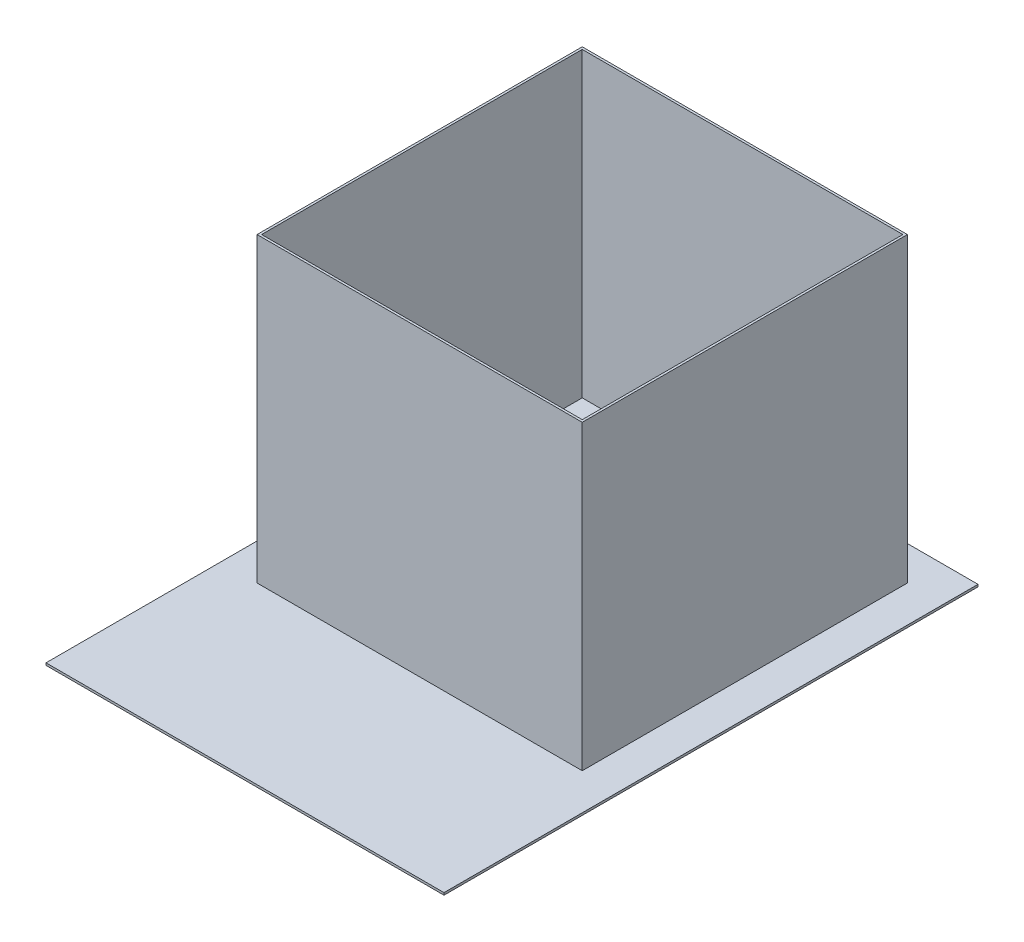
ISO-10303-21;
HEADER;
FILE_DESCRIPTION(('STEP AP214'),'2;1');
FILE_NAME('part.step','',(''),(''),'','','');
FILE_SCHEMA(('AUTOMOTIVE_DESIGN { 1 0 10303 214 1 1 1 1 }'));
ENDSEC;
DATA;
#1=APPLICATION_CONTEXT('core data for automotive mechanical design processes');
#2=APPLICATION_PROTOCOL_DEFINITION('international standard','automotive_design',2000,#1);
#3=PRODUCT_CONTEXT('',#1,'mechanical');
#4=PRODUCT('Part','Part','',(#3));
#5=PRODUCT_RELATED_PRODUCT_CATEGORY('part','',(#4));
#6=PRODUCT_DEFINITION_FORMATION('','',#4);
#7=PRODUCT_DEFINITION_CONTEXT('part definition',#1,'design');
#8=PRODUCT_DEFINITION('design','',#6,#7);
#9=PRODUCT_DEFINITION_SHAPE('','',#8);
#10=(LENGTH_UNIT() NAMED_UNIT(*) SI_UNIT(.MILLI.,.METRE.));
#11=(NAMED_UNIT(*) PLANE_ANGLE_UNIT() SI_UNIT($,.RADIAN.));
#12=(NAMED_UNIT(*) SI_UNIT($,.STERADIAN.) SOLID_ANGLE_UNIT());
#13=UNCERTAINTY_MEASURE_WITH_UNIT(LENGTH_MEASURE(1.E-05),#10,'distance_accuracy_value','');
#14=(GEOMETRIC_REPRESENTATION_CONTEXT(3) GLOBAL_UNCERTAINTY_ASSIGNED_CONTEXT((#13)) GLOBAL_UNIT_ASSIGNED_CONTEXT((#10,
#11,#12)) REPRESENTATION_CONTEXT('',''));
#15=CARTESIAN_POINT('',(0.,0.,0.));
#16=DIRECTION('',(0.,0.,1.));
#17=DIRECTION('',(1.,0.,0.));
#18=AXIS2_PLACEMENT_3D('',#15,#16,#17);
#19=CARTESIAN_POINT('',(0.,80.,0.));
#20=DIRECTION('',(0.,-1.,0.));
#21=DIRECTION('',(0.,0.,-1.));
#22=AXIS2_PLACEMENT_3D('',#19,#20,#21);
#23=PLANE('',#22);
#24=DIRECTION('',(0.,0.,1.));
#25=VECTOR('',#24,1.);
#26=CARTESIAN_POINT('',(-0.6,80.,0.6));
#27=LINE('',#26,#25);
#28=CARTESIAN_POINT('',(-0.6,80.,-85.6));
#29=VERTEX_POINT('',#28);
#30=CARTESIAN_POINT('',(-0.6,80.,0.6));
#31=VERTEX_POINT('',#30);
#32=EDGE_CURVE('E203',#29,#31,#27,.T.);
#33=ORIENTED_EDGE('',*,*,#32,.T.);
#34=DIRECTION('',(1.,0.,0.));
#35=VECTOR('',#34,1.);
#36=CARTESIAN_POINT('',(-0.6,80.,0.6));
#37=LINE('',#36,#35);
#38=CARTESIAN_POINT('',(85.6,80.,0.6));
#39=VERTEX_POINT('',#38);
#40=EDGE_CURVE('E207',#31,#39,#37,.T.);
#41=ORIENTED_EDGE('',*,*,#40,.T.);
#42=DIRECTION('',(0.,0.,-1.));
#43=VECTOR('',#42,1.);
#44=CARTESIAN_POINT('',(85.6,80.,0.6));
#45=LINE('',#44,#43);
#46=CARTESIAN_POINT('',(85.6,80.,-85.6));
#47=VERTEX_POINT('',#46);
#48=EDGE_CURVE('E211',#39,#47,#45,.T.);
#49=ORIENTED_EDGE('',*,*,#48,.T.);
#50=DIRECTION('',(-1.,0.,0.));
#51=VECTOR('',#50,1.);
#52=CARTESIAN_POINT('',(-0.6,80.,-85.6));
#53=LINE('',#52,#51);
#54=EDGE_CURVE('E214',#47,#29,#53,.T.);
#55=ORIENTED_EDGE('',*,*,#54,.T.);
#56=EDGE_LOOP('',(#33,#41,#49,#55));
#57=FACE_BOUND('',#56,.T.);
#58=DIRECTION('',(0.,0.,1.));
#59=VECTOR('',#58,1.);
#60=CARTESIAN_POINT('',(0.,80.,0.));
#61=LINE('',#60,#59);
#62=CARTESIAN_POINT('',(0.,80.,-85.));
#63=VERTEX_POINT('',#62);
#64=CARTESIAN_POINT('',(0.,80.,0.));
#65=VERTEX_POINT('',#64);
#66=EDGE_CURVE('E168',#63,#65,#61,.T.);
#67=ORIENTED_EDGE('',*,*,#66,.F.);
#68=DIRECTION('',(-1.,0.,0.));
#69=VECTOR('',#68,1.);
#70=CARTESIAN_POINT('',(0.,80.,-85.));
#71=LINE('',#70,#69);
#72=CARTESIAN_POINT('',(85.,80.,-85.));
#73=VERTEX_POINT('',#72);
#74=EDGE_CURVE('E178',#73,#63,#71,.T.);
#75=ORIENTED_EDGE('',*,*,#74,.F.);
#76=DIRECTION('',(0.,0.,-1.));
#77=VECTOR('',#76,1.);
#78=CARTESIAN_POINT('',(85.,80.,0.));
#79=LINE('',#78,#77);
#80=CARTESIAN_POINT('',(85.,80.,0.));
#81=VERTEX_POINT('',#80);
#82=EDGE_CURVE('E175',#81,#73,#79,.T.);
#83=ORIENTED_EDGE('',*,*,#82,.F.);
#84=DIRECTION('',(1.,0.,0.));
#85=VECTOR('',#84,1.);
#86=CARTESIAN_POINT('',(0.,80.,0.));
#87=LINE('',#86,#85);
#88=EDGE_CURVE('E171',#65,#81,#87,.T.);
#89=ORIENTED_EDGE('',*,*,#88,.F.);
#90=EDGE_LOOP('',(#67,#75,#83,#89));
#91=FACE_BOUND('',#90,.T.);
#92=ADVANCED_FACE('F39',(#57,#91),#23,.F.);
#93=CARTESIAN_POINT('',(-0.6,80.,0.6));
#94=DIRECTION('',(1.,0.,0.));
#95=DIRECTION('',(0.,0.,-1.));
#96=AXIS2_PLACEMENT_3D('',#93,#94,#95);
#97=PLANE('',#96);
#98=DIRECTION('',(0.,0.,1.));
#99=VECTOR('',#98,1.);
#100=CARTESIAN_POINT('',(-0.6,0.,0.6));
#101=LINE('',#100,#99);
#102=CARTESIAN_POINT('',(-0.6,0.,-85.6));
#103=VERTEX_POINT('',#102);
#104=CARTESIAN_POINT('',(-0.6,0.,0.6));
#105=VERTEX_POINT('',#104);
#106=EDGE_CURVE('E202',#103,#105,#101,.T.);
#107=ORIENTED_EDGE('',*,*,#106,.T.);
#108=DIRECTION('',(0.,-1.,0.));
#109=VECTOR('',#108,1.);
#110=CARTESIAN_POINT('',(-0.6,80.,0.6));
#111=LINE('',#110,#109);
#112=EDGE_CURVE('E11',#31,#105,#111,.T.);
#113=ORIENTED_EDGE('',*,*,#112,.F.);
#114=ORIENTED_EDGE('',*,*,#32,.F.);
#115=DIRECTION('',(0.,-1.,0.));
#116=VECTOR('',#115,1.);
#117=CARTESIAN_POINT('',(-0.6,80.,-85.6));
#118=LINE('',#117,#116);
#119=EDGE_CURVE('E217',#29,#103,#118,.T.);
#120=ORIENTED_EDGE('',*,*,#119,.T.);
#121=EDGE_LOOP('',(#107,#113,#114,#120));
#122=FACE_BOUND('',#121,.T.);
#123=ADVANCED_FACE('F41',(#122),#97,.F.);
#124=CARTESIAN_POINT('',(-0.6,80.,0.6));
#125=DIRECTION('',(0.,0.,-1.));
#126=DIRECTION('',(-1.,0.,0.));
#127=AXIS2_PLACEMENT_3D('',#124,#125,#126);
#128=PLANE('',#127);
#129=DIRECTION('',(1.,0.,0.));
#130=VECTOR('',#129,1.);
#131=CARTESIAN_POINT('',(-0.6,0.,0.6));
#132=LINE('',#131,#130);
#133=CARTESIAN_POINT('',(85.6,0.,0.6));
#134=VERTEX_POINT('',#133);
#135=EDGE_CURVE('E221',#105,#134,#132,.T.);
#136=ORIENTED_EDGE('',*,*,#135,.T.);
#137=DIRECTION('',(0.,-1.,0.));
#138=VECTOR('',#137,1.);
#139=CARTESIAN_POINT('',(85.6,80.,0.6));
#140=LINE('',#139,#138);
#141=EDGE_CURVE('E48',#39,#134,#140,.T.);
#142=ORIENTED_EDGE('',*,*,#141,.F.);
#143=ORIENTED_EDGE('',*,*,#40,.F.);
#144=ORIENTED_EDGE('',*,*,#112,.T.);
#145=EDGE_LOOP('',(#136,#142,#143,#144));
#146=FACE_BOUND('',#145,.T.);
#147=ADVANCED_FACE('F246',(#146),#128,.F.);
#148=CARTESIAN_POINT('',(85.6,80.,0.6));
#149=DIRECTION('',(-1.,0.,0.));
#150=DIRECTION('',(0.,0.,1.));
#151=AXIS2_PLACEMENT_3D('',#148,#149,#150);
#152=PLANE('',#151);
#153=DIRECTION('',(0.,0.,-1.));
#154=VECTOR('',#153,1.);
#155=CARTESIAN_POINT('',(85.6,0.,0.6));
#156=LINE('',#155,#154);
#157=CARTESIAN_POINT('',(85.6,0.,-85.6));
#158=VERTEX_POINT('',#157);
#159=EDGE_CURVE('E225',#134,#158,#156,.T.);
#160=ORIENTED_EDGE('',*,*,#159,.T.);
#161=DIRECTION('',(0.,-1.,0.));
#162=VECTOR('',#161,1.);
#163=CARTESIAN_POINT('',(85.6,80.,-85.6));
#164=LINE('',#163,#162);
#165=EDGE_CURVE('E235',#47,#158,#164,.T.);
#166=ORIENTED_EDGE('',*,*,#165,.F.);
#167=ORIENTED_EDGE('',*,*,#48,.F.);
#168=ORIENTED_EDGE('',*,*,#141,.T.);
#169=EDGE_LOOP('',(#160,#166,#167,#168));
#170=FACE_BOUND('',#169,.T.);
#171=ADVANCED_FACE('F243',(#170),#152,.F.);
#172=CARTESIAN_POINT('',(-0.6,80.,-85.6));
#173=DIRECTION('',(0.,0.,1.));
#174=DIRECTION('',(1.,0.,0.));
#175=AXIS2_PLACEMENT_3D('',#172,#173,#174);
#176=PLANE('',#175);
#177=DIRECTION('',(-1.,0.,0.));
#178=VECTOR('',#177,1.);
#179=CARTESIAN_POINT('',(-0.6,0.,-85.6));
#180=LINE('',#179,#178);
#181=EDGE_CURVE('E208',#158,#103,#180,.T.);
#182=ORIENTED_EDGE('',*,*,#181,.T.);
#183=ORIENTED_EDGE('',*,*,#119,.F.);
#184=ORIENTED_EDGE('',*,*,#54,.F.);
#185=ORIENTED_EDGE('',*,*,#165,.T.);
#186=EDGE_LOOP('',(#182,#183,#184,#185));
#187=FACE_BOUND('',#186,.T.);
#188=ADVANCED_FACE('F252',(#187),#176,.F.);
#189=CARTESIAN_POINT('',(0.,80.,0.));
#190=DIRECTION('',(1.,0.,0.));
#191=DIRECTION('',(0.,0.,-1.));
#192=AXIS2_PLACEMENT_3D('',#189,#190,#191);
#193=PLANE('',#192);
#194=DIRECTION('',(0.,0.,1.));
#195=VECTOR('',#194,1.);
#196=CARTESIAN_POINT('',(0.,0.,0.));
#197=LINE('',#196,#195);
#198=CARTESIAN_POINT('',(0.,0.,-85.));
#199=VERTEX_POINT('',#198);
#200=CARTESIAN_POINT('',(0.,0.,0.));
#201=VERTEX_POINT('',#200);
#202=EDGE_CURVE('E63',#199,#201,#197,.T.);
#203=ORIENTED_EDGE('',*,*,#202,.F.);
#204=DIRECTION('',(0.,-1.,0.));
#205=VECTOR('',#204,1.);
#206=CARTESIAN_POINT('',(0.,80.,-85.));
#207=LINE('',#206,#205);
#208=EDGE_CURVE('E180',#63,#199,#207,.T.);
#209=ORIENTED_EDGE('',*,*,#208,.F.);
#210=ORIENTED_EDGE('',*,*,#66,.T.);
#211=DIRECTION('',(0.,-1.,0.));
#212=VECTOR('',#211,1.);
#213=CARTESIAN_POINT('',(0.,80.,0.));
#214=LINE('',#213,#212);
#215=EDGE_CURVE('E199',#65,#201,#214,.T.);
#216=ORIENTED_EDGE('',*,*,#215,.T.);
#217=EDGE_LOOP('',(#203,#209,#210,#216));
#218=FACE_BOUND('',#217,.T.);
#219=ADVANCED_FACE('F265',(#218),#193,.T.);
#220=CARTESIAN_POINT('',(0.,80.,0.));
#221=DIRECTION('',(0.,0.,-1.));
#222=DIRECTION('',(-1.,0.,0.));
#223=AXIS2_PLACEMENT_3D('',#220,#221,#222);
#224=PLANE('',#223);
#225=DIRECTION('',(1.,0.,0.));
#226=VECTOR('',#225,1.);
#227=CARTESIAN_POINT('',(0.,0.,0.));
#228=LINE('',#227,#226);
#229=CARTESIAN_POINT('',(85.,0.,0.));
#230=VERTEX_POINT('',#229);
#231=EDGE_CURVE('E162',#201,#230,#228,.T.);
#232=ORIENTED_EDGE('',*,*,#231,.F.);
#233=ORIENTED_EDGE('',*,*,#215,.F.);
#234=ORIENTED_EDGE('',*,*,#88,.T.);
#235=DIRECTION('',(0.,-1.,0.));
#236=VECTOR('',#235,1.);
#237=CARTESIAN_POINT('',(85.,80.,0.));
#238=LINE('',#237,#236);
#239=EDGE_CURVE('E196',#81,#230,#238,.T.);
#240=ORIENTED_EDGE('',*,*,#239,.T.);
#241=EDGE_LOOP('',(#232,#233,#234,#240));
#242=FACE_BOUND('',#241,.T.);
#243=ADVANCED_FACE('F267',(#242),#224,.T.);
#244=CARTESIAN_POINT('',(85.,80.,0.));
#245=DIRECTION('',(-1.,0.,0.));
#246=DIRECTION('',(0.,0.,1.));
#247=AXIS2_PLACEMENT_3D('',#244,#245,#246);
#248=PLANE('',#247);
#249=DIRECTION('',(0.,0.,-1.));
#250=VECTOR('',#249,1.);
#251=CARTESIAN_POINT('',(85.,0.,0.));
#252=LINE('',#251,#250);
#253=CARTESIAN_POINT('',(85.,0.,-85.));
#254=VERTEX_POINT('',#253);
#255=EDGE_CURVE('E185',#230,#254,#252,.T.);
#256=ORIENTED_EDGE('',*,*,#255,.F.);
#257=ORIENTED_EDGE('',*,*,#239,.F.);
#258=ORIENTED_EDGE('',*,*,#82,.T.);
#259=DIRECTION('',(0.,-1.,0.));
#260=VECTOR('',#259,1.);
#261=CARTESIAN_POINT('',(85.,80.,-85.));
#262=LINE('',#261,#260);
#263=EDGE_CURVE('E55',#73,#254,#262,.T.);
#264=ORIENTED_EDGE('',*,*,#263,.T.);
#265=EDGE_LOOP('',(#256,#257,#258,#264));
#266=FACE_BOUND('',#265,.T.);
#267=ADVANCED_FACE('F274',(#266),#248,.T.);
#268=CARTESIAN_POINT('',(0.,80.,-85.));
#269=DIRECTION('',(0.,0.,1.));
#270=DIRECTION('',(1.,0.,0.));
#271=AXIS2_PLACEMENT_3D('',#268,#269,#270);
#272=PLANE('',#271);
#273=DIRECTION('',(-1.,0.,0.));
#274=VECTOR('',#273,1.);
#275=CARTESIAN_POINT('',(0.,0.,-85.));
#276=LINE('',#275,#274);
#277=EDGE_CURVE('E172',#254,#199,#276,.T.);
#278=ORIENTED_EDGE('',*,*,#277,.F.);
#279=ORIENTED_EDGE('',*,*,#263,.F.);
#280=ORIENTED_EDGE('',*,*,#74,.T.);
#281=ORIENTED_EDGE('',*,*,#208,.T.);
#282=EDGE_LOOP('',(#278,#279,#280,#281));
#283=FACE_BOUND('',#282,.T.);
#284=ADVANCED_FACE('F272',(#283),#272,.T.);
#285=CARTESIAN_POINT('',(0.,0.,0.));
#286=DIRECTION('',(0.,1.,0.));
#287=DIRECTION('',(0.,0.,1.));
#288=AXIS2_PLACEMENT_3D('',#285,#286,#287);
#289=PLANE('',#288);
#290=ORIENTED_EDGE('',*,*,#255,.T.);
#291=ORIENTED_EDGE('',*,*,#277,.T.);
#292=ORIENTED_EDGE('',*,*,#202,.T.);
#293=ORIENTED_EDGE('',*,*,#231,.T.);
#294=EDGE_LOOP('',(#290,#291,#292,#293));
#295=FACE_BOUND('',#294,.T.);
#296=ADVANCED_FACE('F271',(#295),#289,.T.);
#297=DIRECTION('',(0.,0.,-1.));
#298=VECTOR('',#297,1.);
#299=CARTESIAN_POINT('',(-10.2535871057214,0.,-94.6568270705885));
#300=LINE('',#299,#298);
#301=CARTESIAN_POINT('',(-10.2535871057214,0.,46.894653262863));
#302=VERTEX_POINT('',#301);
#303=CARTESIAN_POINT('',(-10.2535871057214,0.,-94.6568270705885));
#304=VERTEX_POINT('',#303);
#305=EDGE_CURVE('E157',#302,#304,#300,.T.);
#306=ORIENTED_EDGE('',*,*,#305,.F.);
#307=DIRECTION('',(-1.,0.,0.));
#308=VECTOR('',#307,1.);
#309=CARTESIAN_POINT('',(-10.2535871057214,0.,46.894653262863));
#310=LINE('',#309,#308);
#311=CARTESIAN_POINT('',(95.2535871057213,0.,46.894653262863));
#312=VERTEX_POINT('',#311);
#313=EDGE_CURVE('E153',#312,#302,#310,.T.);
#314=ORIENTED_EDGE('',*,*,#313,.F.);
#315=DIRECTION('',(0.,0.,1.));
#316=VECTOR('',#315,1.);
#317=CARTESIAN_POINT('',(95.2535871057214,0.,-94.6568270705884));
#318=LINE('',#317,#316);
#319=CARTESIAN_POINT('',(95.2535871057214,0.,-94.6568270705884));
#320=VERTEX_POINT('',#319);
#321=EDGE_CURVE('E405',#320,#312,#318,.T.);
#322=ORIENTED_EDGE('',*,*,#321,.F.);
#323=DIRECTION('',(1.,0.,0.));
#324=VECTOR('',#323,1.);
#325=CARTESIAN_POINT('',(95.2535871057214,0.,-94.6568270705884));
#326=LINE('',#325,#324);
#327=EDGE_CURVE('E409',#304,#320,#326,.T.);
#328=ORIENTED_EDGE('',*,*,#327,.F.);
#329=EDGE_LOOP('',(#306,#314,#322,#328));
#330=FACE_BOUND('',#329,.T.);
#331=ORIENTED_EDGE('',*,*,#106,.F.);
#332=ORIENTED_EDGE('',*,*,#181,.F.);
#333=ORIENTED_EDGE('',*,*,#159,.F.);
#334=ORIENTED_EDGE('',*,*,#135,.F.);
#335=EDGE_LOOP('',(#331,#332,#333,#334));
#336=FACE_BOUND('',#335,.T.);
#337=ADVANCED_FACE('F249',(#330,#336),#289,.T.);
#338=CARTESIAN_POINT('',(-10.2535871057214,-0.6,-94.6568270705885));
#339=DIRECTION('',(1.,0.,0.));
#340=DIRECTION('',(0.,0.,-1.));
#341=AXIS2_PLACEMENT_3D('',#338,#339,#340);
#342=PLANE('',#341);
#343=ORIENTED_EDGE('',*,*,#305,.T.);
#344=DIRECTION('',(0.,1.,0.));
#345=VECTOR('',#344,1.);
#346=CARTESIAN_POINT('',(-10.2535871057214,-0.6,-94.6568270705885));
#347=LINE('',#346,#345);
#348=CARTESIAN_POINT('',(-10.2535871057214,-0.6,-94.6568270705885));
#349=VERTEX_POINT('',#348);
#350=EDGE_CURVE('E135',#349,#304,#347,.T.);
#351=ORIENTED_EDGE('',*,*,#350,.F.);
#352=DIRECTION('',(0.,0.,-1.));
#353=VECTOR('',#352,1.);
#354=CARTESIAN_POINT('',(-10.2535871057214,-0.6,-94.6568270705885));
#355=LINE('',#354,#353);
#356=CARTESIAN_POINT('',(-10.2535871057214,-0.6,46.894653262863));
#357=VERTEX_POINT('',#356);
#358=EDGE_CURVE('E143',#357,#349,#355,.T.);
#359=ORIENTED_EDGE('',*,*,#358,.F.);
#360=DIRECTION('',(0.,1.,0.));
#361=VECTOR('',#360,1.);
#362=CARTESIAN_POINT('',(-10.2535871057214,-0.6,46.894653262863));
#363=LINE('',#362,#361);
#364=EDGE_CURVE('E401',#357,#302,#363,.T.);
#365=ORIENTED_EDGE('',*,*,#364,.T.);
#366=EDGE_LOOP('',(#343,#351,#359,#365));
#367=FACE_BOUND('',#366,.T.);
#368=ADVANCED_FACE('F155',(#367),#342,.F.);
#369=CARTESIAN_POINT('',(95.2535871057214,-0.6,-94.6568270705884));
#370=DIRECTION('',(0.,0.,1.));
#371=DIRECTION('',(1.,0.,0.));
#372=AXIS2_PLACEMENT_3D('',#369,#370,#371);
#373=PLANE('',#372);
#374=ORIENTED_EDGE('',*,*,#327,.T.);
#375=DIRECTION('',(0.,1.,0.));
#376=VECTOR('',#375,1.);
#377=CARTESIAN_POINT('',(95.2535871057214,-0.6,-94.6568270705884));
#378=LINE('',#377,#376);
#379=CARTESIAN_POINT('',(95.2535871057214,-0.6,-94.6568270705884));
#380=VERTEX_POINT('',#379);
#381=EDGE_CURVE('E138',#380,#320,#378,.T.);
#382=ORIENTED_EDGE('',*,*,#381,.F.);
#383=DIRECTION('',(1.,0.,0.));
#384=VECTOR('',#383,1.);
#385=CARTESIAN_POINT('',(95.2535871057214,-0.6,-94.6568270705884));
#386=LINE('',#385,#384);
#387=EDGE_CURVE('E131',#349,#380,#386,.T.);
#388=ORIENTED_EDGE('',*,*,#387,.F.);
#389=ORIENTED_EDGE('',*,*,#350,.T.);
#390=EDGE_LOOP('',(#374,#382,#388,#389));
#391=FACE_BOUND('',#390,.T.);
#392=ADVANCED_FACE('F133',(#391),#373,.F.);
#393=CARTESIAN_POINT('',(95.2535871057214,-0.6,-94.6568270705884));
#394=DIRECTION('',(-1.,0.,0.));
#395=DIRECTION('',(0.,0.,1.));
#396=AXIS2_PLACEMENT_3D('',#393,#394,#395);
#397=PLANE('',#396);
#398=ORIENTED_EDGE('',*,*,#321,.T.);
#399=DIRECTION('',(0.,1.,0.));
#400=VECTOR('',#399,1.);
#401=CARTESIAN_POINT('',(95.2535871057213,-0.6,46.894653262863));
#402=LINE('',#401,#400);
#403=CARTESIAN_POINT('',(95.2535871057213,-0.6,46.894653262863));
#404=VERTEX_POINT('',#403);
#405=EDGE_CURVE('E164',#404,#312,#402,.T.);
#406=ORIENTED_EDGE('',*,*,#405,.F.);
#407=DIRECTION('',(0.,0.,1.));
#408=VECTOR('',#407,1.);
#409=CARTESIAN_POINT('',(95.2535871057214,-0.6,-94.6568270705884));
#410=LINE('',#409,#408);
#411=EDGE_CURVE('E142',#380,#404,#410,.T.);
#412=ORIENTED_EDGE('',*,*,#411,.F.);
#413=ORIENTED_EDGE('',*,*,#381,.T.);
#414=EDGE_LOOP('',(#398,#406,#412,#413));
#415=FACE_BOUND('',#414,.T.);
#416=ADVANCED_FACE('F365',(#415),#397,.F.);
#417=CARTESIAN_POINT('',(-10.2535871057214,-0.6,46.894653262863));
#418=DIRECTION('',(0.,0.,-1.));
#419=DIRECTION('',(-1.,0.,0.));
#420=AXIS2_PLACEMENT_3D('',#417,#418,#419);
#421=PLANE('',#420);
#422=ORIENTED_EDGE('',*,*,#313,.T.);
#423=ORIENTED_EDGE('',*,*,#364,.F.);
#424=DIRECTION('',(-1.,0.,0.));
#425=VECTOR('',#424,1.);
#426=CARTESIAN_POINT('',(-10.2535871057214,-0.6,46.894653262863));
#427=LINE('',#426,#425);
#428=EDGE_CURVE('E148',#404,#357,#427,.T.);
#429=ORIENTED_EDGE('',*,*,#428,.F.);
#430=ORIENTED_EDGE('',*,*,#405,.T.);
#431=EDGE_LOOP('',(#422,#423,#429,#430));
#432=FACE_BOUND('',#431,.T.);
#433=ADVANCED_FACE('F373',(#432),#421,.F.);
#434=CARTESIAN_POINT('',(0.,-0.6,0.));
#435=DIRECTION('',(0.,1.,0.));
#436=DIRECTION('',(0.,0.,1.));
#437=AXIS2_PLACEMENT_3D('',#434,#435,#436);
#438=PLANE('',#437);
#439=ORIENTED_EDGE('',*,*,#358,.T.);
#440=ORIENTED_EDGE('',*,*,#387,.T.);
#441=ORIENTED_EDGE('',*,*,#411,.T.);
#442=ORIENTED_EDGE('',*,*,#428,.T.);
#443=EDGE_LOOP('',(#439,#440,#441,#442));
#444=FACE_BOUND('',#443,.T.);
#445=ADVANCED_FACE('F146',(#444),#438,.F.);
#446=CLOSED_SHELL('',(#92,#123,#147,#171,#188,#219,#243,#267,#284,#296,#337,#368,#392,#416,#433,#445));
#447=MANIFOLD_SOLID_BREP('B2',#446);
#448=ADVANCED_BREP_SHAPE_REPRESENTATION('',(#18,#447),#14);
#449=SHAPE_DEFINITION_REPRESENTATION(#9,#448);
ENDSEC;
END-ISO-10303-21;
